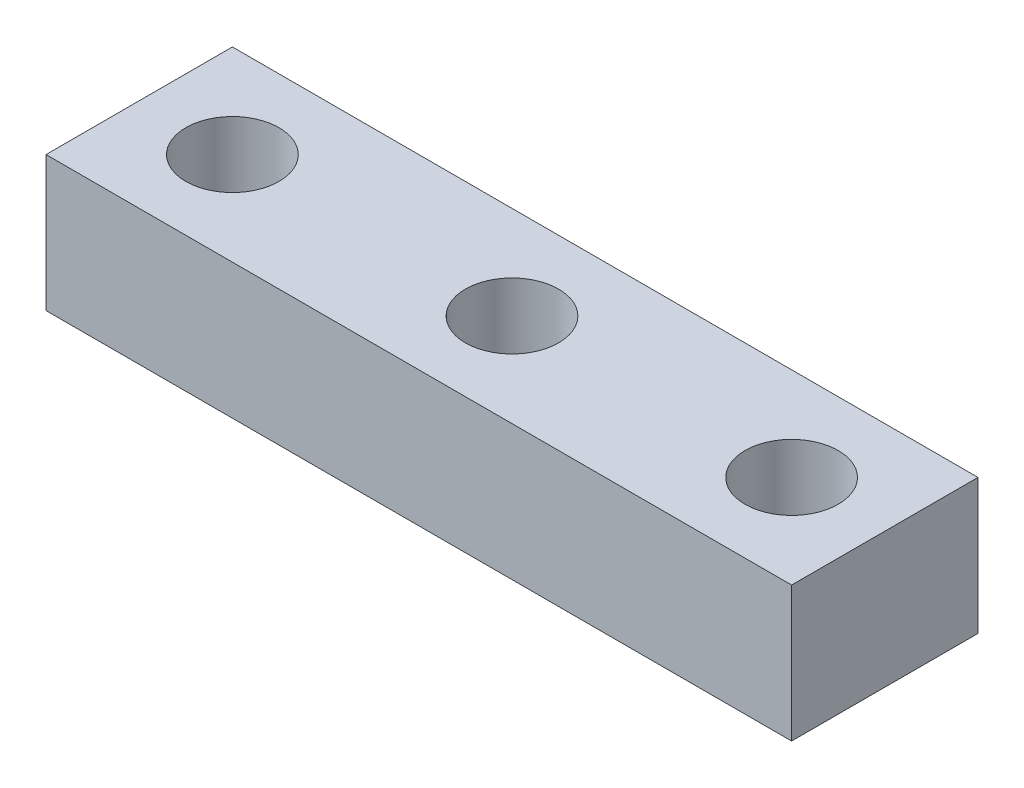
ISO-10303-21;
HEADER;
FILE_DESCRIPTION(('STEP AP214'),'2;1');
FILE_NAME('part.step','',(''),(''),'','','');
FILE_SCHEMA(('AUTOMOTIVE_DESIGN { 1 0 10303 214 1 1 1 1 }'));
ENDSEC;
DATA;
#1=APPLICATION_CONTEXT('core data for automotive mechanical design processes');
#2=APPLICATION_PROTOCOL_DEFINITION('international standard','automotive_design',2000,#1);
#3=PRODUCT_CONTEXT('',#1,'mechanical');
#4=PRODUCT('Part','Part','',(#3));
#5=PRODUCT_RELATED_PRODUCT_CATEGORY('part','',(#4));
#6=PRODUCT_DEFINITION_FORMATION('','',#4);
#7=PRODUCT_DEFINITION_CONTEXT('part definition',#1,'design');
#8=PRODUCT_DEFINITION('design','',#6,#7);
#9=PRODUCT_DEFINITION_SHAPE('','',#8);
#10=(LENGTH_UNIT() NAMED_UNIT(*) SI_UNIT(.MILLI.,.METRE.));
#11=(NAMED_UNIT(*) PLANE_ANGLE_UNIT() SI_UNIT($,.RADIAN.));
#12=(NAMED_UNIT(*) SI_UNIT($,.STERADIAN.) SOLID_ANGLE_UNIT());
#13=UNCERTAINTY_MEASURE_WITH_UNIT(LENGTH_MEASURE(1.E-05),#10,'distance_accuracy_value','');
#14=(GEOMETRIC_REPRESENTATION_CONTEXT(3) GLOBAL_UNCERTAINTY_ASSIGNED_CONTEXT((#13)) GLOBAL_UNIT_ASSIGNED_CONTEXT((#10,
#11,#12)) REPRESENTATION_CONTEXT('',''));
#15=CARTESIAN_POINT('',(0.,0.,0.));
#16=DIRECTION('',(0.,0.,1.));
#17=DIRECTION('',(1.,0.,0.));
#18=AXIS2_PLACEMENT_3D('',#15,#16,#17);
#19=CARTESIAN_POINT('',(0.,0.,0.));
#20=DIRECTION('',(0.,-1.,0.));
#21=DIRECTION('',(0.,0.,-1.));
#22=AXIS2_PLACEMENT_3D('',#19,#20,#21);
#23=PLANE('',#22);
#24=DIRECTION('',(0.,0.,-1.));
#25=VECTOR('',#24,1.);
#26=CARTESIAN_POINT('',(40.,0.,10.));
#27=LINE('',#26,#25);
#28=CARTESIAN_POINT('',(40.,0.,10.));
#29=VERTEX_POINT('',#28);
#30=CARTESIAN_POINT('',(40.,0.,-10.));
#31=VERTEX_POINT('',#30);
#32=EDGE_CURVE('E81',#29,#31,#27,.T.);
#33=ORIENTED_EDGE('',*,*,#32,.F.);
#34=DIRECTION('',(1.,0.,0.));
#35=VECTOR('',#34,1.);
#36=CARTESIAN_POINT('',(-40.,0.,10.));
#37=LINE('',#36,#35);
#38=CARTESIAN_POINT('',(-40.,0.,10.));
#39=VERTEX_POINT('',#38);
#40=EDGE_CURVE('E57',#39,#29,#37,.T.);
#41=ORIENTED_EDGE('',*,*,#40,.F.);
#42=DIRECTION('',(0.,0.,1.));
#43=VECTOR('',#42,1.);
#44=CARTESIAN_POINT('',(-40.,0.,10.));
#45=LINE('',#44,#43);
#46=CARTESIAN_POINT('',(-40.,0.,-10.));
#47=VERTEX_POINT('',#46);
#48=EDGE_CURVE('E51',#47,#39,#45,.T.);
#49=ORIENTED_EDGE('',*,*,#48,.F.);
#50=DIRECTION('',(-1.,0.,0.));
#51=VECTOR('',#50,1.);
#52=CARTESIAN_POINT('',(-40.,0.,-10.));
#53=LINE('',#52,#51);
#54=EDGE_CURVE('E73',#31,#47,#53,.T.);
#55=ORIENTED_EDGE('',*,*,#54,.F.);
#56=EDGE_LOOP('',(#33,#41,#49,#55));
#57=FACE_BOUND('',#56,.T.);
#58=CARTESIAN_POINT('',(30.,0.,0.));
#59=DIRECTION('',(0.,1.,0.));
#60=DIRECTION('',(0.,0.,1.));
#61=AXIS2_PLACEMENT_3D('',#58,#59,#60);
#62=CIRCLE('',#61,5.);
#63=CARTESIAN_POINT('',(30.,0.,5.));
#64=VERTEX_POINT('',#63);
#65=EDGE_CURVE('E84',#64,#64,#62,.T.);
#66=ORIENTED_EDGE('',*,*,#65,.T.);
#67=EDGE_LOOP('',(#66));
#68=FACE_BOUND('',#67,.T.);
#69=CARTESIAN_POINT('',(0.,0.,0.));
#70=DIRECTION('',(0.,1.,0.));
#71=DIRECTION('',(0.,0.,1.));
#72=AXIS2_PLACEMENT_3D('',#69,#70,#71);
#73=CIRCLE('',#72,5.);
#74=CARTESIAN_POINT('',(0.,0.,5.));
#75=VERTEX_POINT('',#74);
#76=EDGE_CURVE('E100',#75,#75,#73,.T.);
#77=ORIENTED_EDGE('',*,*,#76,.T.);
#78=EDGE_LOOP('',(#77));
#79=FACE_BOUND('',#78,.T.);
#80=CARTESIAN_POINT('',(-30.,0.,0.));
#81=DIRECTION('',(0.,1.,0.));
#82=DIRECTION('',(0.,0.,1.));
#83=AXIS2_PLACEMENT_3D('',#80,#81,#82);
#84=CIRCLE('',#83,5.);
#85=CARTESIAN_POINT('',(-30.,0.,5.));
#86=VERTEX_POINT('',#85);
#87=EDGE_CURVE('E106',#86,#86,#84,.T.);
#88=ORIENTED_EDGE('',*,*,#87,.T.);
#89=EDGE_LOOP('',(#88));
#90=FACE_BOUND('',#89,.T.);
#91=ADVANCED_FACE('F17',(#57,#68,#79,#90),#23,.T.);
#92=CARTESIAN_POINT('',(40.,14.5,10.));
#93=DIRECTION('',(-1.,0.,0.));
#94=DIRECTION('',(0.,0.,1.));
#95=AXIS2_PLACEMENT_3D('',#92,#93,#94);
#96=PLANE('',#95);
#97=ORIENTED_EDGE('',*,*,#32,.T.);
#98=DIRECTION('',(0.,-1.,0.));
#99=VECTOR('',#98,1.);
#100=CARTESIAN_POINT('',(40.,14.5,-10.));
#101=LINE('',#100,#99);
#102=CARTESIAN_POINT('',(40.,14.5,-10.));
#103=VERTEX_POINT('',#102);
#104=EDGE_CURVE('E11',#103,#31,#101,.T.);
#105=ORIENTED_EDGE('',*,*,#104,.F.);
#106=DIRECTION('',(0.,0.,-1.));
#107=VECTOR('',#106,1.);
#108=CARTESIAN_POINT('',(40.,14.5,10.));
#109=LINE('',#108,#107);
#110=CARTESIAN_POINT('',(40.,14.5,10.));
#111=VERTEX_POINT('',#110);
#112=EDGE_CURVE('E69',#111,#103,#109,.T.);
#113=ORIENTED_EDGE('',*,*,#112,.F.);
#114=DIRECTION('',(0.,-1.,0.));
#115=VECTOR('',#114,1.);
#116=CARTESIAN_POINT('',(40.,14.5,10.));
#117=LINE('',#116,#115);
#118=EDGE_CURVE('E77',#111,#29,#117,.T.);
#119=ORIENTED_EDGE('',*,*,#118,.T.);
#120=EDGE_LOOP('',(#97,#105,#113,#119));
#121=FACE_BOUND('',#120,.T.);
#122=ADVANCED_FACE('F19',(#121),#96,.F.);
#123=CARTESIAN_POINT('',(-40.,14.5,-10.));
#124=DIRECTION('',(0.,0.,1.));
#125=DIRECTION('',(1.,0.,0.));
#126=AXIS2_PLACEMENT_3D('',#123,#124,#125);
#127=PLANE('',#126);
#128=ORIENTED_EDGE('',*,*,#54,.T.);
#129=DIRECTION('',(0.,-1.,0.));
#130=VECTOR('',#129,1.);
#131=CARTESIAN_POINT('',(-40.,14.5,-10.));
#132=LINE('',#131,#130);
#133=CARTESIAN_POINT('',(-40.,14.5,-10.));
#134=VERTEX_POINT('',#133);
#135=EDGE_CURVE('E26',#134,#47,#132,.T.);
#136=ORIENTED_EDGE('',*,*,#135,.F.);
#137=DIRECTION('',(-1.,0.,0.));
#138=VECTOR('',#137,1.);
#139=CARTESIAN_POINT('',(-40.,14.5,-10.));
#140=LINE('',#139,#138);
#141=EDGE_CURVE('E64',#103,#134,#140,.T.);
#142=ORIENTED_EDGE('',*,*,#141,.F.);
#143=ORIENTED_EDGE('',*,*,#104,.T.);
#144=EDGE_LOOP('',(#128,#136,#142,#143));
#145=FACE_BOUND('',#144,.T.);
#146=ADVANCED_FACE('F72',(#145),#127,.F.);
#147=CARTESIAN_POINT('',(-40.,14.5,10.));
#148=DIRECTION('',(1.,0.,0.));
#149=DIRECTION('',(0.,0.,-1.));
#150=AXIS2_PLACEMENT_3D('',#147,#148,#149);
#151=PLANE('',#150);
#152=ORIENTED_EDGE('',*,*,#48,.T.);
#153=DIRECTION('',(0.,-1.,0.));
#154=VECTOR('',#153,1.);
#155=CARTESIAN_POINT('',(-40.,14.5,10.));
#156=LINE('',#155,#154);
#157=CARTESIAN_POINT('',(-40.,14.5,10.));
#158=VERTEX_POINT('',#157);
#159=EDGE_CURVE('E74',#158,#39,#156,.T.);
#160=ORIENTED_EDGE('',*,*,#159,.F.);
#161=DIRECTION('',(0.,0.,1.));
#162=VECTOR('',#161,1.);
#163=CARTESIAN_POINT('',(-40.,14.5,10.));
#164=LINE('',#163,#162);
#165=EDGE_CURVE('E67',#134,#158,#164,.T.);
#166=ORIENTED_EDGE('',*,*,#165,.F.);
#167=ORIENTED_EDGE('',*,*,#135,.T.);
#168=EDGE_LOOP('',(#152,#160,#166,#167));
#169=FACE_BOUND('',#168,.T.);
#170=ADVANCED_FACE('F75',(#169),#151,.F.);
#171=CARTESIAN_POINT('',(-40.,14.5,10.));
#172=DIRECTION('',(0.,0.,-1.));
#173=DIRECTION('',(-1.,0.,0.));
#174=AXIS2_PLACEMENT_3D('',#171,#172,#173);
#175=PLANE('',#174);
#176=ORIENTED_EDGE('',*,*,#40,.T.);
#177=ORIENTED_EDGE('',*,*,#118,.F.);
#178=DIRECTION('',(1.,0.,0.));
#179=VECTOR('',#178,1.);
#180=CARTESIAN_POINT('',(-40.,14.5,10.));
#181=LINE('',#180,#179);
#182=EDGE_CURVE('E34',#158,#111,#181,.T.);
#183=ORIENTED_EDGE('',*,*,#182,.F.);
#184=ORIENTED_EDGE('',*,*,#159,.T.);
#185=EDGE_LOOP('',(#176,#177,#183,#184));
#186=FACE_BOUND('',#185,.T.);
#187=ADVANCED_FACE('F89',(#186),#175,.F.);
#188=CARTESIAN_POINT('',(0.,14.5,0.));
#189=DIRECTION('',(0.,-1.,0.));
#190=DIRECTION('',(0.,0.,-1.));
#191=AXIS2_PLACEMENT_3D('',#188,#189,#190);
#192=PLANE('',#191);
#193=CARTESIAN_POINT('',(-30.,14.5,0.));
#194=DIRECTION('',(0.,1.,0.));
#195=DIRECTION('',(0.,0.,1.));
#196=AXIS2_PLACEMENT_3D('',#193,#194,#195);
#197=CIRCLE('',#196,5.);
#198=CARTESIAN_POINT('',(-30.,14.5,5.));
#199=VERTEX_POINT('',#198);
#200=EDGE_CURVE('E109',#199,#199,#197,.T.);
#201=ORIENTED_EDGE('',*,*,#200,.F.);
#202=EDGE_LOOP('',(#201));
#203=FACE_BOUND('',#202,.T.);
#204=CARTESIAN_POINT('',(0.,14.5,0.));
#205=DIRECTION('',(0.,1.,0.));
#206=DIRECTION('',(0.,0.,1.));
#207=AXIS2_PLACEMENT_3D('',#204,#205,#206);
#208=CIRCLE('',#207,5.);
#209=CARTESIAN_POINT('',(0.,14.5,5.));
#210=VERTEX_POINT('',#209);
#211=EDGE_CURVE('E103',#210,#210,#208,.T.);
#212=ORIENTED_EDGE('',*,*,#211,.F.);
#213=EDGE_LOOP('',(#212));
#214=FACE_BOUND('',#213,.T.);
#215=CARTESIAN_POINT('',(30.,14.5,0.));
#216=DIRECTION('',(0.,1.,0.));
#217=DIRECTION('',(0.,0.,1.));
#218=AXIS2_PLACEMENT_3D('',#215,#216,#217);
#219=CIRCLE('',#218,5.);
#220=CARTESIAN_POINT('',(30.,14.5,5.));
#221=VERTEX_POINT('',#220);
#222=EDGE_CURVE('E97',#221,#221,#219,.T.);
#223=ORIENTED_EDGE('',*,*,#222,.F.);
#224=EDGE_LOOP('',(#223));
#225=FACE_BOUND('',#224,.T.);
#226=ORIENTED_EDGE('',*,*,#112,.T.);
#227=ORIENTED_EDGE('',*,*,#141,.T.);
#228=ORIENTED_EDGE('',*,*,#165,.T.);
#229=ORIENTED_EDGE('',*,*,#182,.T.);
#230=EDGE_LOOP('',(#226,#227,#228,#229));
#231=FACE_BOUND('',#230,.T.);
#232=ADVANCED_FACE('F65',(#203,#214,#225,#231),#192,.F.);
#233=CARTESIAN_POINT('',(30.,14.5,0.));
#234=DIRECTION('',(0.,1.,0.));
#235=DIRECTION('',(0.,0.,1.));
#236=AXIS2_PLACEMENT_3D('',#233,#234,#235);
#237=CYLINDRICAL_SURFACE('',#236,5.);
#238=ORIENTED_EDGE('',*,*,#65,.F.);
#239=EDGE_LOOP('',(#238));
#240=FACE_BOUND('',#239,.T.);
#241=ORIENTED_EDGE('',*,*,#222,.T.);
#242=EDGE_LOOP('',(#241));
#243=FACE_BOUND('',#242,.T.);
#244=ADVANCED_FACE('F117',(#240,#243),#237,.F.);
#245=CARTESIAN_POINT('',(0.,14.5,0.));
#246=DIRECTION('',(0.,1.,0.));
#247=DIRECTION('',(0.,0.,1.));
#248=AXIS2_PLACEMENT_3D('',#245,#246,#247);
#249=CYLINDRICAL_SURFACE('',#248,5.);
#250=ORIENTED_EDGE('',*,*,#76,.F.);
#251=EDGE_LOOP('',(#250));
#252=FACE_BOUND('',#251,.T.);
#253=ORIENTED_EDGE('',*,*,#211,.T.);
#254=EDGE_LOOP('',(#253));
#255=FACE_BOUND('',#254,.T.);
#256=ADVANCED_FACE('F124',(#252,#255),#249,.F.);
#257=CARTESIAN_POINT('',(-30.,14.5,0.));
#258=DIRECTION('',(0.,1.,0.));
#259=DIRECTION('',(0.,0.,1.));
#260=AXIS2_PLACEMENT_3D('',#257,#258,#259);
#261=CYLINDRICAL_SURFACE('',#260,5.);
#262=ORIENTED_EDGE('',*,*,#87,.F.);
#263=EDGE_LOOP('',(#262));
#264=FACE_BOUND('',#263,.T.);
#265=ORIENTED_EDGE('',*,*,#200,.T.);
#266=EDGE_LOOP('',(#265));
#267=FACE_BOUND('',#266,.T.);
#268=ADVANCED_FACE('F113',(#264,#267),#261,.F.);
#269=CLOSED_SHELL('',(#91,#122,#146,#170,#187,#232,#244,#256,#268));
#270=MANIFOLD_SOLID_BREP('B1',#269);
#271=ADVANCED_BREP_SHAPE_REPRESENTATION('',(#18,#270),#14);
#272=SHAPE_DEFINITION_REPRESENTATION(#9,#271);
ENDSEC;
END-ISO-10303-21;
